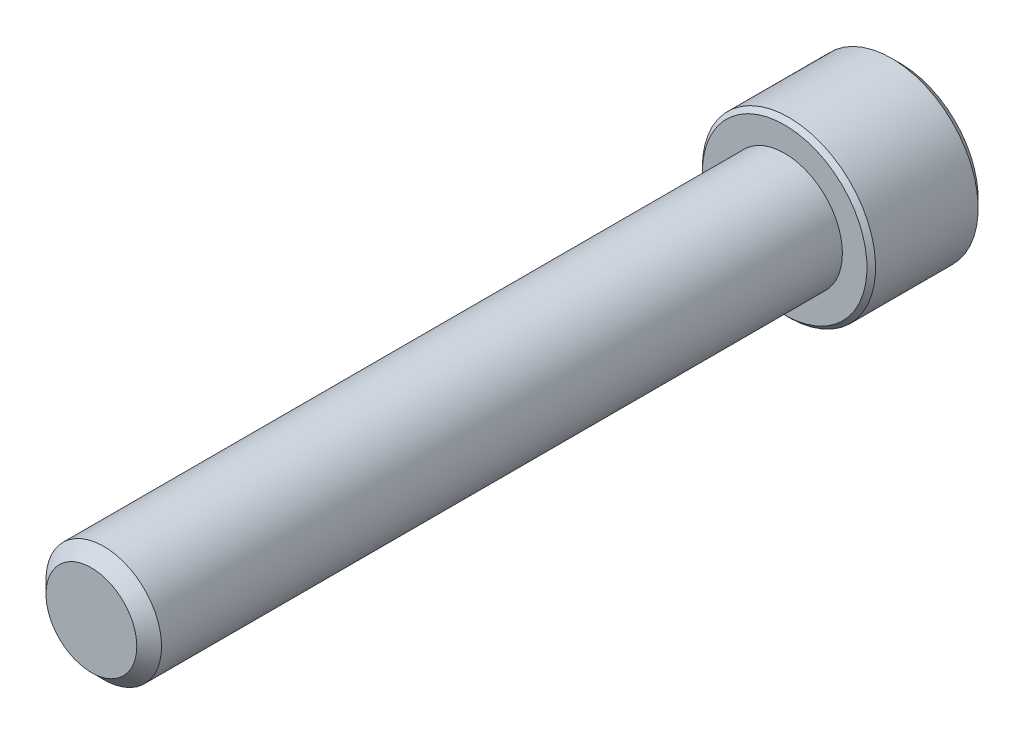
ISO-10303-21;
HEADER;
FILE_DESCRIPTION(('STEP AP214'),'2;1');
FILE_NAME('part.step','',(''),(''),'','','');
FILE_SCHEMA(('AUTOMOTIVE_DESIGN { 1 0 10303 214 1 1 1 1 }'));
ENDSEC;
DATA;
#1=APPLICATION_CONTEXT('core data for automotive mechanical design processes');
#2=APPLICATION_PROTOCOL_DEFINITION('international standard','automotive_design',2000,#1);
#3=PRODUCT_CONTEXT('',#1,'mechanical');
#4=PRODUCT('Part','Part','',(#3));
#5=PRODUCT_RELATED_PRODUCT_CATEGORY('part','',(#4));
#6=PRODUCT_DEFINITION_FORMATION('','',#4);
#7=PRODUCT_DEFINITION_CONTEXT('part definition',#1,'design');
#8=PRODUCT_DEFINITION('design','',#6,#7);
#9=PRODUCT_DEFINITION_SHAPE('','',#8);
#10=(LENGTH_UNIT() NAMED_UNIT(*) SI_UNIT(.MILLI.,.METRE.));
#11=(NAMED_UNIT(*) PLANE_ANGLE_UNIT() SI_UNIT($,.RADIAN.));
#12=(NAMED_UNIT(*) SI_UNIT($,.STERADIAN.) SOLID_ANGLE_UNIT());
#13=UNCERTAINTY_MEASURE_WITH_UNIT(LENGTH_MEASURE(1.E-05),#10,'distance_accuracy_value','');
#14=(GEOMETRIC_REPRESENTATION_CONTEXT(3) GLOBAL_UNCERTAINTY_ASSIGNED_CONTEXT((#13)) GLOBAL_UNIT_ASSIGNED_CONTEXT((#10,
#11,#12)) REPRESENTATION_CONTEXT('',''));
#15=CARTESIAN_POINT('',(0.,0.,0.));
#16=DIRECTION('',(0.,0.,1.));
#17=DIRECTION('',(1.,0.,0.));
#18=AXIS2_PLACEMENT_3D('',#15,#16,#17);
#19=CARTESIAN_POINT('',(0.,0.,-38.1));
#20=DIRECTION('',(0.,0.,1.));
#21=DIRECTION('',(1.,0.,0.));
#22=AXIS2_PLACEMENT_3D('',#19,#20,#21);
#23=CYLINDRICAL_SURFACE('',#22,3.175);
#24=CARTESIAN_POINT('',(0.,0.,-0.680357142857135));
#25=DIRECTION('',(0.,0.,1.));
#26=DIRECTION('',(1.,0.,0.));
#27=AXIS2_PLACEMENT_3D('',#24,#25,#26);
#28=CIRCLE('',#27,3.175);
#29=CARTESIAN_POINT('',(3.175,0.,-0.680357142857135));
#30=VERTEX_POINT('',#29);
#31=EDGE_CURVE('E91',#30,#30,#28,.F.);
#32=ORIENTED_EDGE('',*,*,#31,.T.);
#33=EDGE_LOOP('',(#32));
#34=FACE_BOUND('',#33,.T.);
#35=CARTESIAN_POINT('',(0.,0.,-38.1));
#36=DIRECTION('',(0.,0.,-1.));
#37=DIRECTION('',(-1.,0.,0.));
#38=AXIS2_PLACEMENT_3D('',#35,#36,#37);
#39=CIRCLE('',#38,3.175);
#40=CARTESIAN_POINT('',(-3.175,0.,-38.1));
#41=VERTEX_POINT('',#40);
#42=EDGE_CURVE('E198',#41,#41,#39,.F.);
#43=ORIENTED_EDGE('',*,*,#42,.T.);
#44=EDGE_LOOP('',(#43));
#45=FACE_BOUND('',#44,.T.);
#46=ADVANCED_FACE('F17',(#34,#45),#23,.T.);
#47=CARTESIAN_POINT('',(0.,0.,0.));
#48=DIRECTION('',(0.,0.,1.));
#49=DIRECTION('',(1.,0.,0.));
#50=AXIS2_PLACEMENT_3D('',#47,#48,#49);
#51=PLANE('',#50);
#52=CARTESIAN_POINT('',(0.,0.,0.));
#53=DIRECTION('',(0.,0.,1.));
#54=DIRECTION('',(1.,0.,0.));
#55=AXIS2_PLACEMENT_3D('',#52,#53,#54);
#56=CIRCLE('',#55,2.49464285714286);
#57=CARTESIAN_POINT('',(2.49464285714286,0.,0.));
#58=VERTEX_POINT('',#57);
#59=EDGE_CURVE('E197',#58,#58,#56,.T.);
#60=ORIENTED_EDGE('',*,*,#59,.T.);
#61=EDGE_LOOP('',(#60));
#62=FACE_BOUND('',#61,.T.);
#63=ADVANCED_FACE('F173',(#62),#51,.T.);
#64=CARTESIAN_POINT('',(0.,0.,0.));
#65=DIRECTION('',(0.,0.,-1.));
#66=DIRECTION('',(-1.,0.,0.));
#67=AXIS2_PLACEMENT_3D('',#64,#65,#66);
#68=CONICAL_SURFACE('',#67,2.49464285714286,0.785398163397453);
#69=ORIENTED_EDGE('',*,*,#31,.F.);
#70=EDGE_LOOP('',(#69));
#71=FACE_BOUND('',#70,.T.);
#72=ORIENTED_EDGE('',*,*,#59,.F.);
#73=EDGE_LOOP('',(#72));
#74=FACE_BOUND('',#73,.T.);
#75=ADVANCED_FACE('F180',(#71,#74),#68,.T.);
#76=CARTESIAN_POINT('',(0.,0.,-44.45));
#77=DIRECTION('',(0.,0.,1.));
#78=DIRECTION('',(1.,0.,0.));
#79=AXIS2_PLACEMENT_3D('',#76,#77,#78);
#80=CYLINDRICAL_SURFACE('',#79,4.7625);
#81=CARTESIAN_POINT('',(0.,0.,-38.338125));
#82=DIRECTION('',(0.,0.,-1.));
#83=DIRECTION('',(-1.,0.,0.));
#84=AXIS2_PLACEMENT_3D('',#81,#82,#83);
#85=CIRCLE('',#84,4.7625);
#86=CARTESIAN_POINT('',(-4.7625,0.,-38.338125));
#87=VERTEX_POINT('',#86);
#88=EDGE_CURVE('E25',#87,#87,#85,.T.);
#89=ORIENTED_EDGE('',*,*,#88,.T.);
#90=EDGE_LOOP('',(#89));
#91=FACE_BOUND('',#90,.T.);
#92=CARTESIAN_POINT('',(0.,0.,-43.97375));
#93=DIRECTION('',(0.,0.,-1.));
#94=DIRECTION('',(-1.,0.,0.));
#95=AXIS2_PLACEMENT_3D('',#92,#93,#94);
#96=CIRCLE('',#95,4.7625);
#97=CARTESIAN_POINT('',(-4.7625,0.,-43.97375));
#98=VERTEX_POINT('',#97);
#99=EDGE_CURVE('E154',#98,#98,#96,.F.);
#100=ORIENTED_EDGE('',*,*,#99,.T.);
#101=EDGE_LOOP('',(#100));
#102=FACE_BOUND('',#101,.T.);
#103=ADVANCED_FACE('F159',(#91,#102),#80,.T.);
#104=CARTESIAN_POINT('',(0.,0.,-44.45));
#105=DIRECTION('',(0.,0.,-1.));
#106=DIRECTION('',(-1.,0.,0.));
#107=AXIS2_PLACEMENT_3D('',#104,#105,#106);
#108=PLANE('',#107);
#109=CARTESIAN_POINT('',(0.,0.,-44.45));
#110=DIRECTION('',(0.,0.,-1.));
#111=DIRECTION('',(-1.,0.,0.));
#112=AXIS2_PLACEMENT_3D('',#109,#110,#111);
#113=CIRCLE('',#112,4.28625);
#114=CARTESIAN_POINT('',(-4.28625,0.,-44.45));
#115=VERTEX_POINT('',#114);
#116=EDGE_CURVE('E90',#115,#115,#113,.T.);
#117=ORIENTED_EDGE('',*,*,#116,.T.);
#118=EDGE_LOOP('',(#117));
#119=FACE_BOUND('',#118,.T.);
#120=CARTESIAN_POINT('',(0.,0.,-44.45));
#121=DIRECTION('',(0.,0.,-1.));
#122=DIRECTION('',(-1.,0.,0.));
#123=AXIS2_PLACEMENT_3D('',#120,#121,#122);
#124=CIRCLE('',#123,2.7496306570156);
#125=CARTESIAN_POINT('',(-2.38125,1.37481532850779,-44.45));
#126=VERTEX_POINT('',#125);
#127=CARTESIAN_POINT('',(0.,2.7496306570156,-44.45));
#128=VERTEX_POINT('',#127);
#129=EDGE_CURVE('E71',#126,#128,#124,.T.);
#130=ORIENTED_EDGE('',*,*,#129,.F.);
#131=CARTESIAN_POINT('',(-2.38125,-1.3748153285078,-44.45));
#132=VERTEX_POINT('',#131);
#133=EDGE_CURVE('E31',#132,#126,#124,.T.);
#134=ORIENTED_EDGE('',*,*,#133,.F.);
#135=CARTESIAN_POINT('',(0.,-2.7496306570156,-44.45));
#136=VERTEX_POINT('',#135);
#137=EDGE_CURVE('E258',#136,#132,#124,.T.);
#138=ORIENTED_EDGE('',*,*,#137,.F.);
#139=CARTESIAN_POINT('',(2.38125,-1.37481532850779,-44.45));
#140=VERTEX_POINT('',#139);
#141=EDGE_CURVE('E38',#140,#136,#124,.T.);
#142=ORIENTED_EDGE('',*,*,#141,.F.);
#143=CARTESIAN_POINT('',(2.38125,1.3748153285078,-44.45));
#144=VERTEX_POINT('',#143);
#145=EDGE_CURVE('E112',#144,#140,#124,.T.);
#146=ORIENTED_EDGE('',*,*,#145,.F.);
#147=EDGE_CURVE('E80',#128,#144,#124,.T.);
#148=ORIENTED_EDGE('',*,*,#147,.F.);
#149=EDGE_LOOP('',(#130,#134,#138,#142,#146,#148));
#150=FACE_BOUND('',#149,.T.);
#151=ADVANCED_FACE('F111',(#119,#150),#108,.T.);
#152=CARTESIAN_POINT('',(0.,0.,-38.1));
#153=DIRECTION('',(0.,0.,-1.));
#154=DIRECTION('',(-1.,0.,0.));
#155=AXIS2_PLACEMENT_3D('',#152,#153,#154);
#156=PLANE('',#155);
#157=CARTESIAN_POINT('',(0.,0.,-38.1));
#158=DIRECTION('',(0.,0.,-1.));
#159=DIRECTION('',(-1.,0.,0.));
#160=AXIS2_PLACEMENT_3D('',#157,#158,#159);
#161=CIRCLE('',#160,4.524375);
#162=CARTESIAN_POINT('',(-4.524375,0.,-38.1));
#163=VERTEX_POINT('',#162);
#164=EDGE_CURVE('E11',#163,#163,#161,.F.);
#165=ORIENTED_EDGE('',*,*,#164,.T.);
#166=EDGE_LOOP('',(#165));
#167=FACE_BOUND('',#166,.T.);
#168=ORIENTED_EDGE('',*,*,#42,.F.);
#169=EDGE_LOOP('',(#168));
#170=FACE_BOUND('',#169,.T.);
#171=ADVANCED_FACE('F271',(#167,#170),#156,.F.);
#172=CARTESIAN_POINT('',(0.,0.,-44.45));
#173=DIRECTION('',(0.,0.,-1.));
#174=DIRECTION('',(-1.,0.,0.));
#175=AXIS2_PLACEMENT_3D('',#172,#173,#174);
#176=CONICAL_SURFACE('',#175,2.7496306570156,0.78539816339745);
#177=ORIENTED_EDGE('',*,*,#147,.T.);
#178=CARTESIAN_POINT('',(-0.000199999999998986,2.74974612706943,-44.4501154773272));
#179=CARTESIAN_POINT('',(0.0816567823790504,2.70248609172789,-44.4028948967095));
#180=CARTESIAN_POINT('',(0.164882333771761,2.65443579722786,-44.3584475752929));
#181=CARTESIAN_POINT('',(0.33458848083804,2.55645590753601,-44.2770654569856));
#182=CARTESIAN_POINT('',(0.421085217353102,2.50651699342501,-44.2401759430951));
#183=CARTESIAN_POINT('',(0.595501774009041,2.40581754748858,-44.1769834131659));
#184=CARTESIAN_POINT('',(0.683377171180673,2.35508266327639,-44.1505215587295));
#185=CARTESIAN_POINT('',(0.861062594070875,2.25249593653966,-44.1097515156161));
#186=CARTESIAN_POINT('',(0.950867191185871,2.20064722822084,-44.0954128915306));
#187=CARTESIAN_POINT('',(1.10563960313034,2.11128933452158,-44.0824757847701));
#188=CARTESIAN_POINT('',(1.17040744896962,2.07389560129144,-44.0805606046532));
#189=CARTESIAN_POINT('',(1.29983727933558,1.99916925388849,-44.0837866227677));
#190=CARTESIAN_POINT('',(1.36449921879336,1.96183666573622,-44.0889302948571));
#191=CARTESIAN_POINT('',(1.4932125485774,1.88752399013711,-44.1059813108716));
#192=CARTESIAN_POINT('',(1.55726317423486,1.85054434417201,-44.1178962213493));
#193=CARTESIAN_POINT('',(1.68425683890527,1.77722451768917,-44.147835672352));
#194=CARTESIAN_POINT('',(1.74719996243582,1.74088428837517,-44.1658597445185));
#195=CARTESIAN_POINT('',(1.90842615073218,1.64780030516185,-44.2193688075524));
#196=CARTESIAN_POINT('',(2.00570949128784,1.59163374230437,-44.2588874208722));
#197=CARTESIAN_POINT('',(2.14875606262557,1.50904576583588,-44.3256003435508));
#198=CARTESIAN_POINT('',(2.19589628894397,1.4818293434813,-44.3490402091113));
#199=CARTESIAN_POINT('',(2.28930352636664,1.42790064981106,-44.3980566766595));
#200=CARTESIAN_POINT('',(2.33557105249682,1.40118808114506,-44.4236319667669));
#201=CARTESIAN_POINT('',(2.38145,1.37469985845396,-44.4501154773272));
#202=B_SPLINE_CURVE_WITH_KNOTS('',3,(#178,#179,#180,#181,#182,#183,#184,#185,#186,#187,#188,
#189,#190,#191,#192,#193,#194,#195,#196,#197,#198,#199,#200,#201),.UNSPECIFIED.,.F.,.F.,(4,2,2,
2,2,2,2,2,2,2,2,4),(0.,0.31719661061195,0.636241461041216,0.950218950629221,1.26340583824126,
1.48752413747844,1.71172100167747,1.93616888974082,2.16059957440836,2.51709639744763,
2.69486147369099,2.87251813383154),.UNSPECIFIED.);
#203=EDGE_CURVE('E85',#128,#144,#202,.T.);
#204=ORIENTED_EDGE('',*,*,#203,.F.);
#205=EDGE_LOOP('',(#177,#204));
#206=FACE_BOUND('',#205,.T.);
#207=ADVANCED_FACE('F86',(#206),#176,.F.);
#208=ORIENTED_EDGE('',*,*,#145,.T.);
#209=CARTESIAN_POINT('',(2.38125,-2.74194290589387,-45.3319808945799));
#210=CARTESIAN_POINT('',(2.38125,-2.6751796105604,-45.2815846679781));
#211=CARTESIAN_POINT('',(2.38125,-2.60804251112752,-45.2316755875907));
#212=CARTESIAN_POINT('',(2.38125,-2.47287325055307,-45.1330498309857));
#213=CARTESIAN_POINT('',(2.38125,-2.40484086895313,-45.0843334572448));
#214=CARTESIAN_POINT('',(2.38125,-2.26723593505441,-44.9879648544535));
#215=CARTESIAN_POINT('',(2.38125,-2.19765553346049,-44.9403237954326));
#216=CARTESIAN_POINT('',(2.38125,-2.05731367842203,-44.8468199233866));
#217=CARTESIAN_POINT('',(2.38125,-1.98655230892573,-44.8009569847287));
#218=CARTESIAN_POINT('',(2.38125,-1.83957751909225,-44.7088459007133));
#219=CARTESIAN_POINT('',(2.38125,-1.76328361992075,-44.6627255173928));
#220=CARTESIAN_POINT('',(2.38125,-1.60891357704459,-44.5735183038905));
#221=CARTESIAN_POINT('',(2.38125,-1.53083712149136,-44.5304320099754));
#222=CARTESIAN_POINT('',(2.38125,-1.37291620334513,-44.4482265014712));
#223=CARTESIAN_POINT('',(2.38125,-1.29307799938227,-44.4090953578519));
#224=CARTESIAN_POINT('',(2.38125,-1.13121425093132,-44.3356679503151));
#225=CARTESIAN_POINT('',(2.38125,-1.04918943681795,-44.3013700954537));
#226=CARTESIAN_POINT('',(2.38125,-0.889535256759271,-44.2413546314156));
#227=CARTESIAN_POINT('',(2.38125,-0.812083865770255,-44.215168478432));
#228=CARTESIAN_POINT('',(2.38125,-0.655316366527658,-44.1690097514869));
#229=CARTESIAN_POINT('',(2.38125,-0.576000130216828,-44.1490376055837));
#230=CARTESIAN_POINT('',(2.38125,-0.417295761573374,-44.1166821452488));
#231=CARTESIAN_POINT('',(2.38125,-0.337934576883845,-44.1041688083547));
#232=CARTESIAN_POINT('',(2.38125,-0.178363852969582,-44.0869738601659));
#233=CARTESIAN_POINT('',(2.38125,-0.0981544619617657,-44.0822909026126));
#234=CARTESIAN_POINT('',(2.38125,0.0594188034321292,-44.0811044408392));
#235=CARTESIAN_POINT('',(2.38125,0.136780588525992,-44.0843110105046));
#236=CARTESIAN_POINT('',(2.38125,0.290840960607337,-44.0980870567428));
#237=CARTESIAN_POINT('',(2.38125,0.367539482435407,-44.1086572485871));
#238=CARTESIAN_POINT('',(2.38125,0.521017492835386,-44.1367628298525));
#239=CARTESIAN_POINT('',(2.38125,0.597774958394046,-44.1544167489315));
#240=CARTESIAN_POINT('',(2.38125,0.749609814257008,-44.1957513962434));
#241=CARTESIAN_POINT('',(2.38125,0.824687344568027,-44.2194316201903));
#242=CARTESIAN_POINT('',(2.38125,1.06107814410025,-44.3028948629559));
#243=CARTESIAN_POINT('',(2.38125,1.21904786221809,-44.3721839270396));
#244=CARTESIAN_POINT('',(2.38125,1.4502100026734,-44.4876640838597));
#245=CARTESIAN_POINT('',(2.38125,1.52644290442583,-44.5281730572583));
#246=CARTESIAN_POINT('',(2.38125,1.67717618538171,-44.6123026892371));
#247=CARTESIAN_POINT('',(2.38125,1.75167687358838,-44.6559227870999));
#248=CARTESIAN_POINT('',(2.38125,1.89548152088326,-44.743412556489));
#249=CARTESIAN_POINT('',(2.38125,1.96485959608997,-44.7871617927418));
#250=CARTESIAN_POINT('',(2.38125,2.10242624411168,-44.8765011587306));
#251=CARTESIAN_POINT('',(2.38125,2.17061472626632,-44.922091427904));
#252=CARTESIAN_POINT('',(2.38125,2.30540317317353,-45.0144060050932));
#253=CARTESIAN_POINT('',(2.38125,2.37201154222166,-45.0611180928962));
#254=CARTESIAN_POINT('',(2.38125,2.50431800054459,-45.1557775780183));
#255=CARTESIAN_POINT('',(2.38125,2.57001633510792,-45.2037246320963));
#256=CARTESIAN_POINT('',(2.38125,2.63533378855947,-45.2521767335425));
#257=B_SPLINE_CURVE_WITH_KNOTS('',3,(#209,#210,#211,#212,#213,#214,#215,#216,#217,#218,#219,
#220,#221,#222,#223,#224,#225,#226,#227,#228,#229,#230,#231,#232,#233,#234,#235,#236,#237,#238,
#239,#240,#241,#242,#243,#244,#245,#246,#247,#248,#249,#250,#251,#252,#253,#254,#255,#256),
.UNSPECIFIED.,.F.,.F.,(4,2,2,2,2,2,2,2,2,2,2,2,2,2,2,2,2,2,2,2,2,2,2,4),(0.,0.250951284009993,
0.501965564827887,0.754924775973597,1.00786608164543,1.27526207798894,1.54270521780084,
1.80931602029341,2.07583885812521,2.32089852590465,2.56597507114537,2.80664400307699,
3.04727155311266,3.27918940971452,3.51112979698763,3.74712477407483,3.98310000940112,
4.49898139184704,4.75794323931353,5.01685853149447,5.2628896001536,5.50893933794672,
5.75299038397142,5.99697431627971),.UNSPECIFIED.);
#258=EDGE_CURVE('E79',#144,#140,#257,.F.);
#259=ORIENTED_EDGE('',*,*,#258,.F.);
#260=EDGE_LOOP('',(#208,#259));
#261=FACE_BOUND('',#260,.T.);
#262=ADVANCED_FACE('F264',(#261),#176,.F.);
#263=ORIENTED_EDGE('',*,*,#141,.T.);
#264=CARTESIAN_POINT('',(2.38145,-1.37469985845396,-44.4501154773272));
#265=CARTESIAN_POINT('',(2.29959321762095,-1.4219598937955,-44.4028948967095));
#266=CARTESIAN_POINT('',(2.21636766622824,-1.47001018829554,-44.3584475752929));
#267=CARTESIAN_POINT('',(2.04666151916196,-1.56799007798739,-44.2770654569856));
#268=CARTESIAN_POINT('',(1.9601647826469,-1.61792899209838,-44.2401759430951));
#269=CARTESIAN_POINT('',(1.78574822599096,-1.71862843803482,-44.1769834131659));
#270=CARTESIAN_POINT('',(1.69787282881933,-1.769363322247,-44.1505215587295));
#271=CARTESIAN_POINT('',(1.52018740592913,-1.87195004898373,-44.1097515156161));
#272=CARTESIAN_POINT('',(1.43038280881413,-1.92379875730254,-44.0954128915306));
#273=CARTESIAN_POINT('',(1.27561039686966,-2.01315665100181,-44.0824757847701));
#274=CARTESIAN_POINT('',(1.21084255103038,-2.05055038423195,-44.0805606046532));
#275=CARTESIAN_POINT('',(1.08141272066442,-2.1252767316349,-44.0837866227677));
#276=CARTESIAN_POINT('',(1.01675078120664,-2.16260931978718,-44.0889302948571));
#277=CARTESIAN_POINT('',(0.888037451422602,-2.23692199538629,-44.1059813108716));
#278=CARTESIAN_POINT('',(0.823986825765144,-2.27390164135138,-44.1178962213493));
#279=CARTESIAN_POINT('',(0.696993161094725,-2.34722146783423,-44.147835672352));
#280=CARTESIAN_POINT('',(0.634050037564175,-2.38356169714822,-44.1658597445185));
#281=CARTESIAN_POINT('',(0.472823849267818,-2.47664568036154,-44.2193688075524));
#282=CARTESIAN_POINT('',(0.375540508712161,-2.53281224321902,-44.2588874208722));
#283=CARTESIAN_POINT('',(0.23249393737443,-2.61540021968751,-44.3256003435508));
#284=CARTESIAN_POINT('',(0.185353711056035,-2.6426166420421,-44.3490402091113));
#285=CARTESIAN_POINT('',(0.0919464736333614,-2.69654533571234,-44.3980566766595));
#286=CARTESIAN_POINT('',(0.0456789475031791,-2.72325790437833,-44.4236319667669));
#287=CARTESIAN_POINT('',(-0.000199999999997933,-2.74974612706943,-44.4501154773272));
#288=B_SPLINE_CURVE_WITH_KNOTS('',3,(#264,#265,#266,#267,#268,#269,#270,#271,#272,#273,#274,
#275,#276,#277,#278,#279,#280,#281,#282,#283,#284,#285,#286,#287),.UNSPECIFIED.,.F.,.F.,(4,2,2,
2,2,2,2,2,2,2,2,4),(0.,0.31719661061195,0.636241461041216,0.950218950629221,1.26340583824126,
1.48752413747844,1.71172100167747,1.93616888974082,2.16059957440836,2.51709639744763,
2.69486147369099,2.87251813383154),.UNSPECIFIED.);
#289=EDGE_CURVE('E122',#140,#136,#288,.T.);
#290=ORIENTED_EDGE('',*,*,#289,.F.);
#291=EDGE_LOOP('',(#263,#290));
#292=FACE_BOUND('',#291,.T.);
#293=ADVANCED_FACE('F261',(#292),#176,.F.);
#294=ORIENTED_EDGE('',*,*,#137,.T.);
#295=CARTESIAN_POINT('',(0.000199999999999919,-2.74974612706943,-44.4501154773272));
#296=CARTESIAN_POINT('',(-0.0816567823790496,-2.70248609172789,-44.4028948967095));
#297=CARTESIAN_POINT('',(-0.16488233377176,-2.65443579722786,-44.3584475752929));
#298=CARTESIAN_POINT('',(-0.334588480838038,-2.55645590753601,-44.2770654569856));
#299=CARTESIAN_POINT('',(-0.421085217353101,-2.50651699342501,-44.2401759430951));
#300=CARTESIAN_POINT('',(-0.59550177400904,-2.40581754748858,-44.1769834131659));
#301=CARTESIAN_POINT('',(-0.683377171180672,-2.35508266327639,-44.1505215587295));
#302=CARTESIAN_POINT('',(-0.861062594070875,-2.25249593653966,-44.1097515156161));
#303=CARTESIAN_POINT('',(-0.950867191185871,-2.20064722822084,-44.0954128915306));
#304=CARTESIAN_POINT('',(-1.10563960313034,-2.11128933452158,-44.0824757847701));
#305=CARTESIAN_POINT('',(-1.17040744896962,-2.07389560129144,-44.0805606046532));
#306=CARTESIAN_POINT('',(-1.29983727933558,-1.99916925388849,-44.0837866227677));
#307=CARTESIAN_POINT('',(-1.36449921879336,-1.96183666573622,-44.0889302948571));
#308=CARTESIAN_POINT('',(-1.4932125485774,-1.88752399013711,-44.1059813108716));
#309=CARTESIAN_POINT('',(-1.55726317423486,-1.85054434417201,-44.1178962213493));
#310=CARTESIAN_POINT('',(-1.68425683890527,-1.77722451768917,-44.147835672352));
#311=CARTESIAN_POINT('',(-1.74719996243582,-1.74088428837517,-44.1658597445185));
#312=CARTESIAN_POINT('',(-1.90842615073218,-1.64780030516185,-44.2193688075524));
#313=CARTESIAN_POINT('',(-2.00570949128784,-1.59163374230437,-44.2588874208722));
#314=CARTESIAN_POINT('',(-2.14875606262557,-1.50904576583588,-44.3256003435508));
#315=CARTESIAN_POINT('',(-2.19589628894397,-1.4818293434813,-44.3490402091113));
#316=CARTESIAN_POINT('',(-2.28930352636664,-1.42790064981106,-44.3980566766595));
#317=CARTESIAN_POINT('',(-2.33557105249682,-1.40118808114506,-44.4236319667669));
#318=CARTESIAN_POINT('',(-2.38145,-1.37469985845396,-44.4501154773272));
#319=B_SPLINE_CURVE_WITH_KNOTS('',3,(#295,#296,#297,#298,#299,#300,#301,#302,#303,#304,#305,
#306,#307,#308,#309,#310,#311,#312,#313,#314,#315,#316,#317,#318),.UNSPECIFIED.,.F.,.F.,(4,2,2,
2,2,2,2,2,2,2,2,4),(0.,0.31719661061195,0.636241461041216,0.950218950629221,1.26340583824126,
1.48752413747844,1.71172100167747,1.93616888974082,2.16059957440836,2.51709639744763,
2.69486147369099,2.87251813383154),.UNSPECIFIED.);
#320=EDGE_CURVE('E234',#136,#132,#319,.T.);
#321=ORIENTED_EDGE('',*,*,#320,.F.);
#322=EDGE_LOOP('',(#294,#321));
#323=FACE_BOUND('',#322,.T.);
#324=ADVANCED_FACE('F260',(#323),#176,.F.);
#325=ORIENTED_EDGE('',*,*,#133,.T.);
#326=CARTESIAN_POINT('',(-2.38125,-2.7419429062928,-45.3319808948811));
#327=CARTESIAN_POINT('',(-2.38125,-2.67517961094814,-45.2815846682677));
#328=CARTESIAN_POINT('',(-2.38125,-2.60804251150404,-45.2316755878687));
#329=CARTESIAN_POINT('',(-2.38125,-2.47287325090702,-45.1330498312406));
#330=CARTESIAN_POINT('',(-2.38125,-2.40484086929573,-45.0843334574882));
#331=CARTESIAN_POINT('',(-2.38125,-2.26723593537394,-44.9879648546737));
#332=CARTESIAN_POINT('',(-2.38125,-2.19765553376829,-44.9403237956413));
#333=CARTESIAN_POINT('',(-2.38125,-2.05731367870616,-44.8468199235723));
#334=CARTESIAN_POINT('',(-2.38125,-1.98655230919792,-44.800956984903));
#335=CARTESIAN_POINT('',(-2.38125,-1.8395775193387,-44.7088459008639));
#336=CARTESIAN_POINT('',(-2.38125,-1.76328362015336,-44.6627255175311));
#337=CARTESIAN_POINT('',(-2.38125,-1.60891357724903,-44.5735183040048));
#338=CARTESIAN_POINT('',(-2.38125,-1.53083712168146,-44.530432010078));
#339=CARTESIAN_POINT('',(-2.38125,-1.37291620350604,-44.4482265015513));
#340=CARTESIAN_POINT('',(-2.38125,-1.29307799952832,-44.4090953579213));
#341=CARTESIAN_POINT('',(-2.38125,-1.13121425104687,-44.3356679503644));
#342=CARTESIAN_POINT('',(-2.38125,-1.04918943691786,-44.3013700954936));
#343=CARTESIAN_POINT('',(-2.38125,-0.889535256852421,-44.2413546314484));
#344=CARTESIAN_POINT('',(-2.38125,-0.812083865872977,-44.2151684784655));
#345=CARTESIAN_POINT('',(-2.38125,-0.655316366649835,-44.1690097515196));
#346=CARTESIAN_POINT('',(-2.38125,-0.576000130348889,-44.1490376056151));
#347=CARTESIAN_POINT('',(-2.38125,-0.417295761724875,-44.1166821452753));
#348=CARTESIAN_POINT('',(-2.38125,-0.337934577044899,-44.1041688083777));
#349=CARTESIAN_POINT('',(-2.38125,-0.178363853149422,-44.0869738601797));
#350=CARTESIAN_POINT('',(-2.38125,-0.0981544621508387,-44.0822909026207));
#351=CARTESIAN_POINT('',(-2.38125,0.0594188032260211,-44.0811044408343));
#352=CARTESIAN_POINT('',(-2.38125,0.136780588312058,-44.0843110104925));
#353=CARTESIAN_POINT('',(-2.38125,0.290840960378534,-44.0980870567153));
#354=CARTESIAN_POINT('',(-2.38125,0.367539482199561,-44.1086572485512));
#355=CARTESIAN_POINT('',(-2.38125,0.521017492585634,-44.1367628297993));
#356=CARTESIAN_POINT('',(-2.38125,0.597774958137453,-44.1544167488691));
#357=CARTESIAN_POINT('',(-2.38125,0.749609813987395,-44.1957513961625));
#358=CARTESIAN_POINT('',(-2.38125,0.824687344292234,-44.2194316201001));
#359=CARTESIAN_POINT('',(-2.38125,1.0610781437644,-44.3028948628217));
#360=CARTESIAN_POINT('',(-2.38125,1.21904786183135,-44.3721839268647));
#361=CARTESIAN_POINT('',(-2.38125,1.45021000221341,-44.4876640836207));
#362=CARTESIAN_POINT('',(-2.38125,1.52644290394185,-44.5281730569973));
#363=CARTESIAN_POINT('',(-2.38125,1.67717618485052,-44.6123026889314));
#364=CARTESIAN_POINT('',(-2.38125,1.75167687303397,-44.6559227867715));
#365=CARTESIAN_POINT('',(-2.38125,1.89548152028665,-44.7434125561176));
#366=CARTESIAN_POINT('',(-2.38125,1.9648595954743,-44.78716179235));
#367=CARTESIAN_POINT('',(-2.38125,2.10242624345816,-44.8765011582982));
#368=CARTESIAN_POINT('',(-2.38125,2.17061472559402,-44.9220914274512));
#369=CARTESIAN_POINT('',(-2.38125,2.30540317246411,-45.0144060045998));
#370=CARTESIAN_POINT('',(-2.38125,2.3720115414939,-45.0611180923826));
#371=CARTESIAN_POINT('',(-2.38125,2.50431799978027,-45.1557775774644));
#372=CARTESIAN_POINT('',(-2.38125,2.57001633432539,-45.2037246315223));
#373=CARTESIAN_POINT('',(-2.38125,2.63533378775875,-45.2521767329484));
#374=B_SPLINE_CURVE_WITH_KNOTS('',3,(#326,#327,#328,#329,#330,#331,#332,#333,#334,#335,#336,
#337,#338,#339,#340,#341,#342,#343,#344,#345,#346,#347,#348,#349,#350,#351,#352,#353,#354,#355,
#356,#357,#358,#359,#360,#361,#362,#363,#364,#365,#366,#367,#368,#369,#370,#371,#372,#373),
.UNSPECIFIED.,.F.,.F.,(4,2,2,2,2,2,2,2,2,2,2,2,2,2,2,2,2,2,2,2,2,2,2,4),(0.,0.250951284057756,
0.501965564923437,0.754924776117829,1.00786608183833,1.27526207823641,1.54270521810292,
1.80931602064963,2.07583885853551,2.32089852628727,2.56597507150037,2.80664400340549,
3.04727155341466,3.27918940999226,3.51112979724109,3.74712477430217,3.98310000960233,
4.49898139186047,4.75794323923241,5.01685853131885,5.26288959989712,5.50893933760937,
5.75299038355431,5.99697431578284),.UNSPECIFIED.);
#375=EDGE_CURVE('E101',#132,#126,#374,.T.);
#376=ORIENTED_EDGE('',*,*,#375,.F.);
#377=EDGE_LOOP('',(#325,#376));
#378=FACE_BOUND('',#377,.T.);
#379=ADVANCED_FACE('F279',(#378),#176,.F.);
#380=ORIENTED_EDGE('',*,*,#129,.T.);
#381=CARTESIAN_POINT('',(-2.38145,1.37469985845396,-44.4501154773272));
#382=CARTESIAN_POINT('',(-2.29959321762095,1.4219598937955,-44.4028948967095));
#383=CARTESIAN_POINT('',(-2.21636766622824,1.47001018829553,-44.3584475752929));
#384=CARTESIAN_POINT('',(-2.04666151916196,1.56799007798738,-44.2770654569856));
#385=CARTESIAN_POINT('',(-1.9601647826469,1.61792899209838,-44.2401759430951));
#386=CARTESIAN_POINT('',(-1.78574822599096,1.71862843803481,-44.1769834131659));
#387=CARTESIAN_POINT('',(-1.69787282881933,1.769363322247,-44.1505215587295));
#388=CARTESIAN_POINT('',(-1.52018740592913,1.87195004898373,-44.1097515156161));
#389=CARTESIAN_POINT('',(-1.43038280881413,1.92379875730254,-44.0954128915306));
#390=CARTESIAN_POINT('',(-1.27561039686966,2.01315665100181,-44.0824757847701));
#391=CARTESIAN_POINT('',(-1.21084255103038,2.05055038423195,-44.0805606046532));
#392=CARTESIAN_POINT('',(-1.08141272066442,2.1252767316349,-44.0837866227677));
#393=CARTESIAN_POINT('',(-1.01675078120664,2.16260931978718,-44.0889302948571));
#394=CARTESIAN_POINT('',(-0.8880374514226,2.23692199538629,-44.1059813108716));
#395=CARTESIAN_POINT('',(-0.823986825765143,2.27390164135138,-44.1178962213493));
#396=CARTESIAN_POINT('',(-0.696993161094724,2.34722146783422,-44.147835672352));
#397=CARTESIAN_POINT('',(-0.634050037564172,2.38356169714822,-44.1658597445185));
#398=CARTESIAN_POINT('',(-0.472823849267815,2.47664568036154,-44.2193688075524));
#399=CARTESIAN_POINT('',(-0.375540508712158,2.53281224321902,-44.2588874208722));
#400=CARTESIAN_POINT('',(-0.232493937374427,2.61540021968751,-44.3256003435508));
#401=CARTESIAN_POINT('',(-0.185353711056032,2.6426166420421,-44.3490402091113));
#402=CARTESIAN_POINT('',(-0.0919464736333584,2.69654533571234,-44.3980566766595));
#403=CARTESIAN_POINT('',(-0.0456789475031762,2.72325790437833,-44.4236319667669));
#404=CARTESIAN_POINT('',(0.000200000000000198,2.74974612706943,-44.4501154773272));
#405=B_SPLINE_CURVE_WITH_KNOTS('',3,(#381,#382,#383,#384,#385,#386,#387,#388,#389,#390,#391,
#392,#393,#394,#395,#396,#397,#398,#399,#400,#401,#402,#403,#404),.UNSPECIFIED.,.F.,.F.,(4,2,2,
2,2,2,2,2,2,2,2,4),(0.,0.317196610611949,0.636241461041215,0.95021895062922,1.26340583824126,
1.48752413747844,1.71172100167747,1.93616888974082,2.16059957440837,2.51709639744763,
2.69486147369099,2.87251813383154),.UNSPECIFIED.);
#406=EDGE_CURVE('E75',#126,#128,#405,.T.);
#407=ORIENTED_EDGE('',*,*,#406,.F.);
#408=EDGE_LOOP('',(#380,#407));
#409=FACE_BOUND('',#408,.T.);
#410=ADVANCED_FACE('F73',(#409),#176,.F.);
#411=CARTESIAN_POINT('',(2.38125,4.12444598552339,-40.878125));
#412=DIRECTION('',(0.,0.,-1.));
#413=DIRECTION('',(-1.,0.,0.));
#414=AXIS2_PLACEMENT_3D('',#411,#412,#413);
#415=PLANE('',#414);
#416=DIRECTION('',(0.866025403784439,0.5,0.));
#417=VECTOR('',#416,1.);
#418=CARTESIAN_POINT('',(-2.38125,1.3748153285078,-40.878125));
#419=LINE('',#418,#417);
#420=CARTESIAN_POINT('',(-2.38125,1.3748153285078,-40.878125));
#421=VERTEX_POINT('',#420);
#422=CARTESIAN_POINT('',(0.,2.7496306570156,-40.878125));
#423=VERTEX_POINT('',#422);
#424=EDGE_CURVE('E100',#421,#423,#419,.T.);
#425=ORIENTED_EDGE('',*,*,#424,.T.);
#426=DIRECTION('',(0.866025403784439,-0.5,0.));
#427=VECTOR('',#426,1.);
#428=CARTESIAN_POINT('',(0.,2.7496306570156,-40.878125));
#429=LINE('',#428,#427);
#430=CARTESIAN_POINT('',(2.38125,1.3748153285078,-40.878125));
#431=VERTEX_POINT('',#430);
#432=EDGE_CURVE('E105',#423,#431,#429,.T.);
#433=ORIENTED_EDGE('',*,*,#432,.T.);
#434=DIRECTION('',(0.,-1.,0.));
#435=VECTOR('',#434,1.);
#436=CARTESIAN_POINT('',(2.38125,1.3748153285078,-40.878125));
#437=LINE('',#436,#435);
#438=CARTESIAN_POINT('',(2.38125,-1.3748153285078,-40.878125));
#439=VERTEX_POINT('',#438);
#440=EDGE_CURVE('E220',#431,#439,#437,.T.);
#441=ORIENTED_EDGE('',*,*,#440,.T.);
#442=DIRECTION('',(-0.866025403784439,-0.5,0.));
#443=VECTOR('',#442,1.);
#444=CARTESIAN_POINT('',(2.38125,-1.3748153285078,-40.878125));
#445=LINE('',#444,#443);
#446=CARTESIAN_POINT('',(0.,-2.7496306570156,-40.878125));
#447=VERTEX_POINT('',#446);
#448=EDGE_CURVE('E217',#439,#447,#445,.T.);
#449=ORIENTED_EDGE('',*,*,#448,.T.);
#450=DIRECTION('',(-0.866025403784439,0.5,0.));
#451=VECTOR('',#450,1.);
#452=CARTESIAN_POINT('',(0.,-2.7496306570156,-40.878125));
#453=LINE('',#452,#451);
#454=CARTESIAN_POINT('',(-2.38125,-1.3748153285078,-40.878125));
#455=VERTEX_POINT('',#454);
#456=EDGE_CURVE('E214',#447,#455,#453,.T.);
#457=ORIENTED_EDGE('',*,*,#456,.T.);
#458=DIRECTION('',(0.,1.,0.));
#459=VECTOR('',#458,1.);
#460=CARTESIAN_POINT('',(-2.38125,-1.3748153285078,-40.878125));
#461=LINE('',#460,#459);
#462=EDGE_CURVE('E108',#455,#421,#461,.T.);
#463=ORIENTED_EDGE('',*,*,#462,.T.);
#464=EDGE_LOOP('',(#425,#433,#441,#449,#457,#463));
#465=FACE_BOUND('',#464,.T.);
#466=ADVANCED_FACE('F142',(#465),#415,.T.);
#467=CARTESIAN_POINT('',(0.,2.7496306570156,-40.878125));
#468=DIRECTION('',(0.5,0.866025403784439,0.));
#469=DIRECTION('',(-0.866025403784439,0.5,0.));
#470=AXIS2_PLACEMENT_3D('',#467,#468,#469);
#471=PLANE('',#470);
#472=DIRECTION('',(0.,0.,-1.));
#473=VECTOR('',#472,1.);
#474=CARTESIAN_POINT('',(0.,2.7496306570156,-40.878125));
#475=LINE('',#474,#473);
#476=EDGE_CURVE('E97',#423,#128,#475,.T.);
#477=ORIENTED_EDGE('',*,*,#476,.T.);
#478=ORIENTED_EDGE('',*,*,#203,.T.);
#479=DIRECTION('',(0.,0.,-1.));
#480=VECTOR('',#479,1.);
#481=CARTESIAN_POINT('',(2.38125,1.3748153285078,-40.878125));
#482=LINE('',#481,#480);
#483=EDGE_CURVE('E107',#431,#144,#482,.T.);
#484=ORIENTED_EDGE('',*,*,#483,.F.);
#485=ORIENTED_EDGE('',*,*,#432,.F.);
#486=EDGE_LOOP('',(#477,#478,#484,#485));
#487=FACE_BOUND('',#486,.T.);
#488=ADVANCED_FACE('F103',(#487),#471,.F.);
#489=CARTESIAN_POINT('',(2.38125,1.3748153285078,-40.878125));
#490=DIRECTION('',(1.,0.,0.));
#491=DIRECTION('',(0.,1.,0.));
#492=AXIS2_PLACEMENT_3D('',#489,#490,#491);
#493=PLANE('',#492);
#494=ORIENTED_EDGE('',*,*,#483,.T.);
#495=ORIENTED_EDGE('',*,*,#258,.T.);
#496=DIRECTION('',(0.,0.,-1.));
#497=VECTOR('',#496,1.);
#498=CARTESIAN_POINT('',(2.38125,-1.3748153285078,-40.878125));
#499=LINE('',#498,#497);
#500=EDGE_CURVE('E203',#439,#140,#499,.T.);
#501=ORIENTED_EDGE('',*,*,#500,.F.);
#502=ORIENTED_EDGE('',*,*,#440,.F.);
#503=EDGE_LOOP('',(#494,#495,#501,#502));
#504=FACE_BOUND('',#503,.T.);
#505=ADVANCED_FACE('F131',(#504),#493,.F.);
#506=CARTESIAN_POINT('',(2.38125,-1.3748153285078,-40.878125));
#507=DIRECTION('',(0.5,-0.866025403784439,0.));
#508=DIRECTION('',(0.866025403784439,0.5,0.));
#509=AXIS2_PLACEMENT_3D('',#506,#507,#508);
#510=PLANE('',#509);
#511=ORIENTED_EDGE('',*,*,#500,.T.);
#512=ORIENTED_EDGE('',*,*,#289,.T.);
#513=DIRECTION('',(0.,0.,-1.));
#514=VECTOR('',#513,1.);
#515=CARTESIAN_POINT('',(0.,-2.7496306570156,-40.878125));
#516=LINE('',#515,#514);
#517=EDGE_CURVE('E206',#447,#136,#516,.T.);
#518=ORIENTED_EDGE('',*,*,#517,.F.);
#519=ORIENTED_EDGE('',*,*,#448,.F.);
#520=EDGE_LOOP('',(#511,#512,#518,#519));
#521=FACE_BOUND('',#520,.T.);
#522=ADVANCED_FACE('F135',(#521),#510,.F.);
#523=CARTESIAN_POINT('',(0.,-2.7496306570156,-40.878125));
#524=DIRECTION('',(-0.5,-0.866025403784439,0.));
#525=DIRECTION('',(0.866025403784439,-0.5,0.));
#526=AXIS2_PLACEMENT_3D('',#523,#524,#525);
#527=PLANE('',#526);
#528=ORIENTED_EDGE('',*,*,#517,.T.);
#529=ORIENTED_EDGE('',*,*,#320,.T.);
#530=DIRECTION('',(0.,0.,-1.));
#531=VECTOR('',#530,1.);
#532=CARTESIAN_POINT('',(-2.38125,-1.3748153285078,-40.878125));
#533=LINE('',#532,#531);
#534=EDGE_CURVE('E209',#455,#132,#533,.T.);
#535=ORIENTED_EDGE('',*,*,#534,.F.);
#536=ORIENTED_EDGE('',*,*,#456,.F.);
#537=EDGE_LOOP('',(#528,#529,#535,#536));
#538=FACE_BOUND('',#537,.T.);
#539=ADVANCED_FACE('F242',(#538),#527,.F.);
#540=CARTESIAN_POINT('',(-2.38125,-1.3748153285078,-40.878125));
#541=DIRECTION('',(-1.,0.,0.));
#542=DIRECTION('',(0.,-1.,0.));
#543=AXIS2_PLACEMENT_3D('',#540,#541,#542);
#544=PLANE('',#543);
#545=ORIENTED_EDGE('',*,*,#534,.T.);
#546=ORIENTED_EDGE('',*,*,#375,.T.);
#547=DIRECTION('',(0.,0.,-1.));
#548=VECTOR('',#547,1.);
#549=CARTESIAN_POINT('',(-2.38125,1.3748153285078,-40.878125));
#550=LINE('',#549,#548);
#551=EDGE_CURVE('E99',#421,#126,#550,.T.);
#552=ORIENTED_EDGE('',*,*,#551,.F.);
#553=ORIENTED_EDGE('',*,*,#462,.F.);
#554=EDGE_LOOP('',(#545,#546,#552,#553));
#555=FACE_BOUND('',#554,.T.);
#556=ADVANCED_FACE('F239',(#555),#544,.F.);
#557=CARTESIAN_POINT('',(-2.38125,1.3748153285078,-40.878125));
#558=DIRECTION('',(-0.5,0.866025403784439,0.));
#559=DIRECTION('',(-0.866025403784439,-0.5,0.));
#560=AXIS2_PLACEMENT_3D('',#557,#558,#559);
#561=PLANE('',#560);
#562=ORIENTED_EDGE('',*,*,#551,.T.);
#563=ORIENTED_EDGE('',*,*,#406,.T.);
#564=ORIENTED_EDGE('',*,*,#476,.F.);
#565=ORIENTED_EDGE('',*,*,#424,.F.);
#566=EDGE_LOOP('',(#562,#563,#564,#565));
#567=FACE_BOUND('',#566,.T.);
#568=ADVANCED_FACE('F95',(#567),#561,.F.);
#569=CARTESIAN_POINT('',(0.,0.,-44.45));
#570=DIRECTION('',(0.,0.,1.));
#571=DIRECTION('',(1.,0.,0.));
#572=AXIS2_PLACEMENT_3D('',#569,#570,#571);
#573=CONICAL_SURFACE('',#572,4.28625,0.785398163397446);
#574=ORIENTED_EDGE('',*,*,#99,.F.);
#575=EDGE_LOOP('',(#574));
#576=FACE_BOUND('',#575,.T.);
#577=ORIENTED_EDGE('',*,*,#116,.F.);
#578=EDGE_LOOP('',(#577));
#579=FACE_BOUND('',#578,.T.);
#580=ADVANCED_FACE('F163',(#576,#579),#573,.T.);
#581=CARTESIAN_POINT('',(0.,0.,-38.338125));
#582=DIRECTION('',(0.,0.,-1.));
#583=DIRECTION('',(-1.,0.,0.));
#584=AXIS2_PLACEMENT_3D('',#581,#582,#583);
#585=CONICAL_SURFACE('',#584,4.7625,0.78539816339745);
#586=ORIENTED_EDGE('',*,*,#164,.F.);
#587=EDGE_LOOP('',(#586));
#588=FACE_BOUND('',#587,.T.);
#589=ORIENTED_EDGE('',*,*,#88,.F.);
#590=EDGE_LOOP('',(#589));
#591=FACE_BOUND('',#590,.T.);
#592=ADVANCED_FACE('F19',(#588,#591),#585,.T.);
#593=CLOSED_SHELL('',(#46,#63,#75,#103,#151,#171,#207,#262,#293,#324,#379,#410,#466,#488,#505,
#522,#539,#556,#568,#580,#592));
#594=MANIFOLD_SOLID_BREP('B1',#593);
#595=ADVANCED_BREP_SHAPE_REPRESENTATION('',(#18,#594),#14);
#596=SHAPE_DEFINITION_REPRESENTATION(#9,#595);
ENDSEC;
END-ISO-10303-21;
